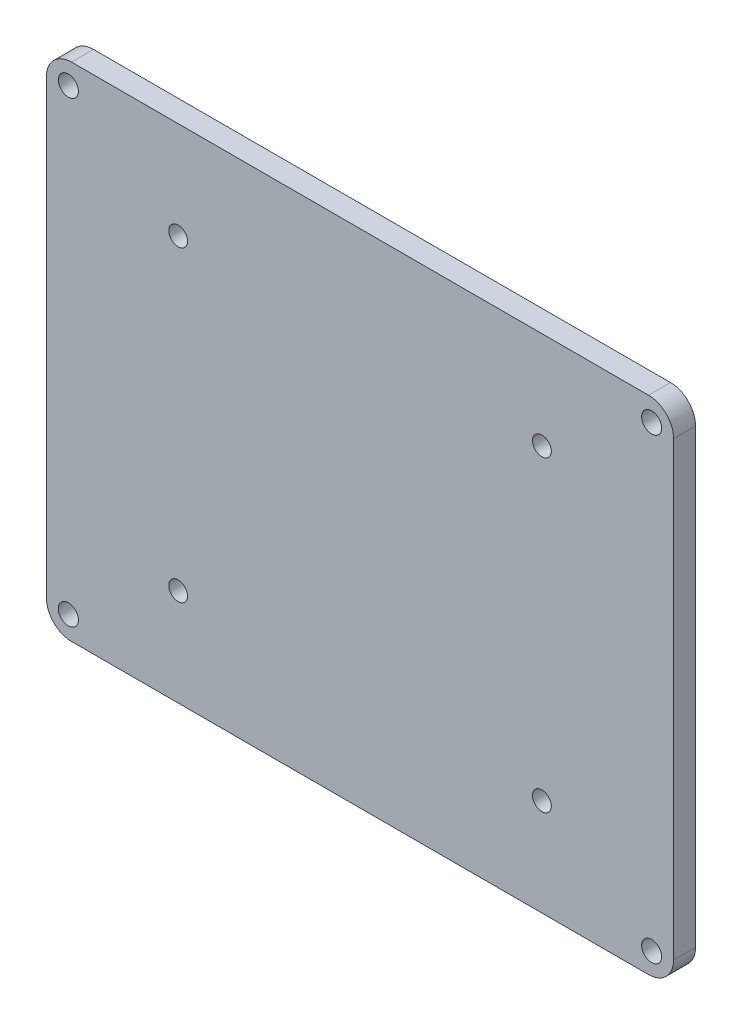
ISO-10303-21;
HEADER;
FILE_DESCRIPTION(('STEP AP214'),'2;1');
FILE_NAME('part.step','',(''),(''),'','','');
FILE_SCHEMA(('AUTOMOTIVE_DESIGN { 1 0 10303 214 1 1 1 1 }'));
ENDSEC;
DATA;
#1=APPLICATION_CONTEXT('core data for automotive mechanical design processes');
#2=APPLICATION_PROTOCOL_DEFINITION('international standard','automotive_design',2000,#1);
#3=PRODUCT_CONTEXT('',#1,'mechanical');
#4=PRODUCT('Part','Part','',(#3));
#5=PRODUCT_RELATED_PRODUCT_CATEGORY('part','',(#4));
#6=PRODUCT_DEFINITION_FORMATION('','',#4);
#7=PRODUCT_DEFINITION_CONTEXT('part definition',#1,'design');
#8=PRODUCT_DEFINITION('design','',#6,#7);
#9=PRODUCT_DEFINITION_SHAPE('','',#8);
#10=(LENGTH_UNIT() NAMED_UNIT(*) SI_UNIT(.MILLI.,.METRE.));
#11=(NAMED_UNIT(*) PLANE_ANGLE_UNIT() SI_UNIT($,.RADIAN.));
#12=(NAMED_UNIT(*) SI_UNIT($,.STERADIAN.) SOLID_ANGLE_UNIT());
#13=UNCERTAINTY_MEASURE_WITH_UNIT(LENGTH_MEASURE(1.E-05),#10,'distance_accuracy_value','');
#14=(GEOMETRIC_REPRESENTATION_CONTEXT(3) GLOBAL_UNCERTAINTY_ASSIGNED_CONTEXT((#13)) GLOBAL_UNIT_ASSIGNED_CONTEXT((#10,
#11,#12)) REPRESENTATION_CONTEXT('',''));
#15=CARTESIAN_POINT('',(0.,0.,0.));
#16=DIRECTION('',(0.,0.,1.));
#17=DIRECTION('',(1.,0.,0.));
#18=AXIS2_PLACEMENT_3D('',#15,#16,#17);
#19=CARTESIAN_POINT('',(46.,36.,3.5));
#20=DIRECTION('',(0.,0.,1.));
#21=DIRECTION('',(1.,0.,0.));
#22=AXIS2_PLACEMENT_3D('',#19,#20,#21);
#23=PLANE('',#22);
#24=CARTESIAN_POINT('',(29.,24.5,3.5));
#25=DIRECTION('',(0.,0.,1.));
#26=DIRECTION('',(1.,0.,0.));
#27=AXIS2_PLACEMENT_3D('',#24,#25,#26);
#28=CIRCLE('',#27,1.5);
#29=CARTESIAN_POINT('',(30.5,24.5,3.5));
#30=VERTEX_POINT('',#29);
#31=EDGE_CURVE('E332',#30,#30,#28,.T.);
#32=ORIENTED_EDGE('',*,*,#31,.F.);
#33=EDGE_LOOP('',(#32));
#34=FACE_BOUND('',#33,.T.);
#35=CARTESIAN_POINT('',(29.,-24.5,3.5));
#36=DIRECTION('',(0.,0.,1.));
#37=DIRECTION('',(1.,0.,0.));
#38=AXIS2_PLACEMENT_3D('',#35,#36,#37);
#39=CIRCLE('',#38,1.5);
#40=CARTESIAN_POINT('',(30.5,-24.5,3.5));
#41=VERTEX_POINT('',#40);
#42=EDGE_CURVE('E326',#41,#41,#39,.T.);
#43=ORIENTED_EDGE('',*,*,#42,.F.);
#44=EDGE_LOOP('',(#43));
#45=FACE_BOUND('',#44,.T.);
#46=CARTESIAN_POINT('',(-29.,-24.5,3.5));
#47=DIRECTION('',(0.,0.,1.));
#48=DIRECTION('',(1.,0.,0.));
#49=AXIS2_PLACEMENT_3D('',#46,#47,#48);
#50=CIRCLE('',#49,1.5);
#51=CARTESIAN_POINT('',(-27.5,-24.5,3.5));
#52=VERTEX_POINT('',#51);
#53=EDGE_CURVE('E318',#52,#52,#50,.T.);
#54=ORIENTED_EDGE('',*,*,#53,.F.);
#55=EDGE_LOOP('',(#54));
#56=FACE_BOUND('',#55,.T.);
#57=CARTESIAN_POINT('',(-29.,24.5,3.5));
#58=DIRECTION('',(0.,0.,1.));
#59=DIRECTION('',(1.,0.,0.));
#60=AXIS2_PLACEMENT_3D('',#57,#58,#59);
#61=CIRCLE('',#60,1.5);
#62=CARTESIAN_POINT('',(-27.5,24.5,3.5));
#63=VERTEX_POINT('',#62);
#64=EDGE_CURVE('E190',#63,#63,#61,.T.);
#65=ORIENTED_EDGE('',*,*,#64,.F.);
#66=EDGE_LOOP('',(#65));
#67=FACE_BOUND('',#66,.T.);
#68=CARTESIAN_POINT('',(-46.5,-36.5,3.5));
#69=DIRECTION('',(0.,0.,1.));
#70=DIRECTION('',(1.,0.,0.));
#71=AXIS2_PLACEMENT_3D('',#68,#69,#70);
#72=CIRCLE('',#71,1.6);
#73=CARTESIAN_POINT('',(-44.9,-36.5,3.5));
#74=VERTEX_POINT('',#73);
#75=EDGE_CURVE('E215',#74,#74,#72,.T.);
#76=ORIENTED_EDGE('',*,*,#75,.F.);
#77=EDGE_LOOP('',(#76));
#78=FACE_BOUND('',#77,.T.);
#79=CARTESIAN_POINT('',(-46.5,36.5,3.5));
#80=DIRECTION('',(0.,0.,1.));
#81=DIRECTION('',(1.,0.,0.));
#82=AXIS2_PLACEMENT_3D('',#79,#80,#81);
#83=CIRCLE('',#82,1.6);
#84=CARTESIAN_POINT('',(-44.9,36.5,3.5));
#85=VERTEX_POINT('',#84);
#86=EDGE_CURVE('E149',#85,#85,#83,.T.);
#87=ORIENTED_EDGE('',*,*,#86,.F.);
#88=EDGE_LOOP('',(#87));
#89=FACE_BOUND('',#88,.T.);
#90=CARTESIAN_POINT('',(46.,36.,3.5));
#91=DIRECTION('',(0.,0.,1.));
#92=DIRECTION('',(1.,0.,0.));
#93=AXIS2_PLACEMENT_3D('',#90,#91,#92);
#94=CIRCLE('',#93,4.);
#95=CARTESIAN_POINT('',(50.,36.,3.5));
#96=VERTEX_POINT('',#95);
#97=CARTESIAN_POINT('',(46.,40.,3.5));
#98=VERTEX_POINT('',#97);
#99=EDGE_CURVE('E167',#96,#98,#94,.T.);
#100=ORIENTED_EDGE('',*,*,#99,.T.);
#101=DIRECTION('',(-1.,0.,0.));
#102=VECTOR('',#101,1.);
#103=CARTESIAN_POINT('',(-46.,40.,3.5));
#104=LINE('',#103,#102);
#105=CARTESIAN_POINT('',(-46.,40.,3.5));
#106=VERTEX_POINT('',#105);
#107=EDGE_CURVE('E103',#98,#106,#104,.T.);
#108=ORIENTED_EDGE('',*,*,#107,.T.);
#109=CARTESIAN_POINT('',(-46.,36.,3.5));
#110=DIRECTION('',(0.,0.,1.));
#111=DIRECTION('',(-1.,0.,0.));
#112=AXIS2_PLACEMENT_3D('',#109,#110,#111);
#113=CIRCLE('',#112,4.);
#114=CARTESIAN_POINT('',(-50.,36.,3.5));
#115=VERTEX_POINT('',#114);
#116=EDGE_CURVE('E241',#106,#115,#113,.T.);
#117=ORIENTED_EDGE('',*,*,#116,.T.);
#118=DIRECTION('',(0.,-1.,0.));
#119=VECTOR('',#118,1.);
#120=CARTESIAN_POINT('',(-50.,-36.,3.5));
#121=LINE('',#120,#119);
#122=CARTESIAN_POINT('',(-50.,-36.,3.5));
#123=VERTEX_POINT('',#122);
#124=EDGE_CURVE('E244',#115,#123,#121,.T.);
#125=ORIENTED_EDGE('',*,*,#124,.T.);
#126=CARTESIAN_POINT('',(-46.,-36.,3.5));
#127=DIRECTION('',(0.,0.,1.));
#128=DIRECTION('',(-1.,0.,0.));
#129=AXIS2_PLACEMENT_3D('',#126,#127,#128);
#130=CIRCLE('',#129,4.);
#131=CARTESIAN_POINT('',(-46.,-40.,3.5));
#132=VERTEX_POINT('',#131);
#133=EDGE_CURVE('E122',#123,#132,#130,.T.);
#134=ORIENTED_EDGE('',*,*,#133,.T.);
#135=DIRECTION('',(1.,0.,0.));
#136=VECTOR('',#135,1.);
#137=CARTESIAN_POINT('',(-46.,-40.,3.5));
#138=LINE('',#137,#136);
#139=CARTESIAN_POINT('',(46.,-40.,3.5));
#140=VERTEX_POINT('',#139);
#141=EDGE_CURVE('E116',#132,#140,#138,.T.);
#142=ORIENTED_EDGE('',*,*,#141,.T.);
#143=CARTESIAN_POINT('',(46.,-36.,3.5));
#144=DIRECTION('',(0.,0.,1.));
#145=DIRECTION('',(1.,0.,0.));
#146=AXIS2_PLACEMENT_3D('',#143,#144,#145);
#147=CIRCLE('',#146,4.);
#148=CARTESIAN_POINT('',(50.,-36.,3.5));
#149=VERTEX_POINT('',#148);
#150=EDGE_CURVE('E120',#140,#149,#147,.T.);
#151=ORIENTED_EDGE('',*,*,#150,.T.);
#152=DIRECTION('',(0.,1.,0.));
#153=VECTOR('',#152,1.);
#154=CARTESIAN_POINT('',(50.,-36.,3.5));
#155=LINE('',#154,#153);
#156=EDGE_CURVE('E60',#149,#96,#155,.T.);
#157=ORIENTED_EDGE('',*,*,#156,.T.);
#158=EDGE_LOOP('',(#100,#108,#117,#125,#134,#142,#151,#157));
#159=FACE_BOUND('',#158,.T.);
#160=CARTESIAN_POINT('',(46.5,36.5,3.5));
#161=DIRECTION('',(0.,0.,1.));
#162=DIRECTION('',(1.,0.,0.));
#163=AXIS2_PLACEMENT_3D('',#160,#161,#162);
#164=CIRCLE('',#163,1.6);
#165=CARTESIAN_POINT('',(48.1,36.5,3.5));
#166=VERTEX_POINT('',#165);
#167=EDGE_CURVE('E223',#166,#166,#164,.T.);
#168=ORIENTED_EDGE('',*,*,#167,.F.);
#169=EDGE_LOOP('',(#168));
#170=FACE_BOUND('',#169,.T.);
#171=CARTESIAN_POINT('',(46.5,-36.5,3.5));
#172=DIRECTION('',(0.,0.,1.));
#173=DIRECTION('',(1.,0.,0.));
#174=AXIS2_PLACEMENT_3D('',#171,#172,#173);
#175=CIRCLE('',#174,1.6);
#176=CARTESIAN_POINT('',(48.1,-36.5,3.5));
#177=VERTEX_POINT('',#176);
#178=EDGE_CURVE('E205',#177,#177,#175,.T.);
#179=ORIENTED_EDGE('',*,*,#178,.F.);
#180=EDGE_LOOP('',(#179));
#181=FACE_BOUND('',#180,.T.);
#182=ADVANCED_FACE('F40',(#34,#45,#56,#67,#78,#89,#159,#170,#181),#23,.T.);
#183=CARTESIAN_POINT('',(46.,36.,0.));
#184=DIRECTION('',(0.,0.,1.));
#185=DIRECTION('',(1.,0.,0.));
#186=AXIS2_PLACEMENT_3D('',#183,#184,#185);
#187=PLANE('',#186);
#188=CARTESIAN_POINT('',(29.,24.5,0.));
#189=DIRECTION('',(0.,0.,1.));
#190=DIRECTION('',(1.,0.,0.));
#191=AXIS2_PLACEMENT_3D('',#188,#189,#190);
#192=CIRCLE('',#191,1.5);
#193=CARTESIAN_POINT('',(30.5,24.5,0.));
#194=VERTEX_POINT('',#193);
#195=EDGE_CURVE('E44',#194,#194,#192,.T.);
#196=ORIENTED_EDGE('',*,*,#195,.T.);
#197=EDGE_LOOP('',(#196));
#198=FACE_BOUND('',#197,.T.);
#199=CARTESIAN_POINT('',(29.,-24.5,0.));
#200=DIRECTION('',(0.,0.,1.));
#201=DIRECTION('',(1.,0.,0.));
#202=AXIS2_PLACEMENT_3D('',#199,#200,#201);
#203=CIRCLE('',#202,1.5);
#204=CARTESIAN_POINT('',(30.5,-24.5,0.));
#205=VERTEX_POINT('',#204);
#206=EDGE_CURVE('E193',#205,#205,#203,.T.);
#207=ORIENTED_EDGE('',*,*,#206,.T.);
#208=EDGE_LOOP('',(#207));
#209=FACE_BOUND('',#208,.T.);
#210=CARTESIAN_POINT('',(-29.,-24.5,0.));
#211=DIRECTION('',(0.,0.,1.));
#212=DIRECTION('',(1.,0.,0.));
#213=AXIS2_PLACEMENT_3D('',#210,#211,#212);
#214=CIRCLE('',#213,1.5);
#215=CARTESIAN_POINT('',(-27.5,-24.5,0.));
#216=VERTEX_POINT('',#215);
#217=EDGE_CURVE('E189',#216,#216,#214,.T.);
#218=ORIENTED_EDGE('',*,*,#217,.T.);
#219=EDGE_LOOP('',(#218));
#220=FACE_BOUND('',#219,.T.);
#221=CARTESIAN_POINT('',(-29.,24.5,0.));
#222=DIRECTION('',(0.,0.,1.));
#223=DIRECTION('',(1.,0.,0.));
#224=AXIS2_PLACEMENT_3D('',#221,#222,#223);
#225=CIRCLE('',#224,1.5);
#226=CARTESIAN_POINT('',(-27.5,24.5,0.));
#227=VERTEX_POINT('',#226);
#228=EDGE_CURVE('E185',#227,#227,#225,.T.);
#229=ORIENTED_EDGE('',*,*,#228,.T.);
#230=EDGE_LOOP('',(#229));
#231=FACE_BOUND('',#230,.T.);
#232=CARTESIAN_POINT('',(46.,36.,0.));
#233=DIRECTION('',(0.,0.,1.));
#234=DIRECTION('',(1.,0.,0.));
#235=AXIS2_PLACEMENT_3D('',#232,#233,#234);
#236=CIRCLE('',#235,4.);
#237=CARTESIAN_POINT('',(50.,36.,0.));
#238=VERTEX_POINT('',#237);
#239=CARTESIAN_POINT('',(46.,40.,0.));
#240=VERTEX_POINT('',#239);
#241=EDGE_CURVE('E144',#238,#240,#236,.T.);
#242=ORIENTED_EDGE('',*,*,#241,.F.);
#243=DIRECTION('',(0.,1.,0.));
#244=VECTOR('',#243,1.);
#245=CARTESIAN_POINT('',(50.,-36.,0.));
#246=LINE('',#245,#244);
#247=CARTESIAN_POINT('',(50.,-36.,0.));
#248=VERTEX_POINT('',#247);
#249=EDGE_CURVE('E95',#248,#238,#246,.T.);
#250=ORIENTED_EDGE('',*,*,#249,.F.);
#251=CARTESIAN_POINT('',(46.,-36.,0.));
#252=DIRECTION('',(0.,0.,1.));
#253=DIRECTION('',(1.,0.,0.));
#254=AXIS2_PLACEMENT_3D('',#251,#252,#253);
#255=CIRCLE('',#254,4.);
#256=CARTESIAN_POINT('',(46.,-40.,0.));
#257=VERTEX_POINT('',#256);
#258=EDGE_CURVE('E89',#257,#248,#255,.T.);
#259=ORIENTED_EDGE('',*,*,#258,.F.);
#260=DIRECTION('',(1.,0.,0.));
#261=VECTOR('',#260,1.);
#262=CARTESIAN_POINT('',(-46.,-40.,0.));
#263=LINE('',#262,#261);
#264=CARTESIAN_POINT('',(-46.,-40.,0.));
#265=VERTEX_POINT('',#264);
#266=EDGE_CURVE('E131',#265,#257,#263,.T.);
#267=ORIENTED_EDGE('',*,*,#266,.F.);
#268=CARTESIAN_POINT('',(-46.,-36.,0.));
#269=DIRECTION('',(0.,0.,1.));
#270=DIRECTION('',(-1.,0.,0.));
#271=AXIS2_PLACEMENT_3D('',#268,#269,#270);
#272=CIRCLE('',#271,4.);
#273=CARTESIAN_POINT('',(-50.,-36.,0.));
#274=VERTEX_POINT('',#273);
#275=EDGE_CURVE('E158',#274,#265,#272,.T.);
#276=ORIENTED_EDGE('',*,*,#275,.F.);
#277=DIRECTION('',(0.,-1.,0.));
#278=VECTOR('',#277,1.);
#279=CARTESIAN_POINT('',(-50.,-36.,0.));
#280=LINE('',#279,#278);
#281=CARTESIAN_POINT('',(-50.,36.,0.));
#282=VERTEX_POINT('',#281);
#283=EDGE_CURVE('E155',#282,#274,#280,.T.);
#284=ORIENTED_EDGE('',*,*,#283,.F.);
#285=CARTESIAN_POINT('',(-46.,36.,0.));
#286=DIRECTION('',(0.,0.,1.));
#287=DIRECTION('',(-1.,0.,0.));
#288=AXIS2_PLACEMENT_3D('',#285,#286,#287);
#289=CIRCLE('',#288,4.);
#290=CARTESIAN_POINT('',(-46.,40.,0.));
#291=VERTEX_POINT('',#290);
#292=EDGE_CURVE('E152',#291,#282,#289,.T.);
#293=ORIENTED_EDGE('',*,*,#292,.F.);
#294=DIRECTION('',(-1.,0.,0.));
#295=VECTOR('',#294,1.);
#296=CARTESIAN_POINT('',(-46.,40.,0.));
#297=LINE('',#296,#295);
#298=EDGE_CURVE('E148',#240,#291,#297,.T.);
#299=ORIENTED_EDGE('',*,*,#298,.F.);
#300=EDGE_LOOP('',(#242,#250,#259,#267,#276,#284,#293,#299));
#301=FACE_BOUND('',#300,.T.);
#302=CARTESIAN_POINT('',(-46.5,36.5,0.));
#303=DIRECTION('',(0.,0.,1.));
#304=DIRECTION('',(1.,0.,0.));
#305=AXIS2_PLACEMENT_3D('',#302,#303,#304);
#306=CIRCLE('',#305,1.6);
#307=CARTESIAN_POINT('',(-44.9,36.5,0.));
#308=VERTEX_POINT('',#307);
#309=EDGE_CURVE('E227',#308,#308,#306,.T.);
#310=ORIENTED_EDGE('',*,*,#309,.T.);
#311=EDGE_LOOP('',(#310));
#312=FACE_BOUND('',#311,.T.);
#313=CARTESIAN_POINT('',(46.5,36.5,0.));
#314=DIRECTION('',(0.,0.,1.));
#315=DIRECTION('',(1.,0.,0.));
#316=AXIS2_PLACEMENT_3D('',#313,#314,#315);
#317=CIRCLE('',#316,1.6);
#318=CARTESIAN_POINT('',(48.1,36.5,0.));
#319=VERTEX_POINT('',#318);
#320=EDGE_CURVE('E219',#319,#319,#317,.T.);
#321=ORIENTED_EDGE('',*,*,#320,.T.);
#322=EDGE_LOOP('',(#321));
#323=FACE_BOUND('',#322,.T.);
#324=CARTESIAN_POINT('',(-46.5,-36.5,0.));
#325=DIRECTION('',(0.,0.,1.));
#326=DIRECTION('',(1.,0.,0.));
#327=AXIS2_PLACEMENT_3D('',#324,#325,#326);
#328=CIRCLE('',#327,1.6);
#329=CARTESIAN_POINT('',(-44.9,-36.5,0.));
#330=VERTEX_POINT('',#329);
#331=EDGE_CURVE('E211',#330,#330,#328,.T.);
#332=ORIENTED_EDGE('',*,*,#331,.T.);
#333=EDGE_LOOP('',(#332));
#334=FACE_BOUND('',#333,.T.);
#335=CARTESIAN_POINT('',(46.5,-36.5,0.));
#336=DIRECTION('',(0.,0.,1.));
#337=DIRECTION('',(1.,0.,0.));
#338=AXIS2_PLACEMENT_3D('',#335,#336,#337);
#339=CIRCLE('',#338,1.6);
#340=CARTESIAN_POINT('',(48.1,-36.5,0.));
#341=VERTEX_POINT('',#340);
#342=EDGE_CURVE('E200',#341,#341,#339,.T.);
#343=ORIENTED_EDGE('',*,*,#342,.T.);
#344=EDGE_LOOP('',(#343));
#345=FACE_BOUND('',#344,.T.);
#346=ADVANCED_FACE('F259',(#198,#209,#220,#231,#301,#312,#323,#334,#345),#187,.F.);
#347=CARTESIAN_POINT('',(46.,36.,3.5));
#348=DIRECTION('',(0.,0.,-1.));
#349=DIRECTION('',(-1.,0.,0.));
#350=AXIS2_PLACEMENT_3D('',#347,#348,#349);
#351=CYLINDRICAL_SURFACE('',#350,4.);
#352=ORIENTED_EDGE('',*,*,#241,.T.);
#353=DIRECTION('',(0.,0.,-1.));
#354=VECTOR('',#353,1.);
#355=CARTESIAN_POINT('',(46.,40.,3.5));
#356=LINE('',#355,#354);
#357=EDGE_CURVE('E11',#98,#240,#356,.T.);
#358=ORIENTED_EDGE('',*,*,#357,.F.);
#359=ORIENTED_EDGE('',*,*,#99,.F.);
#360=DIRECTION('',(0.,0.,-1.));
#361=VECTOR('',#360,1.);
#362=CARTESIAN_POINT('',(50.,36.,3.5));
#363=LINE('',#362,#361);
#364=EDGE_CURVE('E140',#96,#238,#363,.T.);
#365=ORIENTED_EDGE('',*,*,#364,.T.);
#366=EDGE_LOOP('',(#352,#358,#359,#365));
#367=FACE_BOUND('',#366,.T.);
#368=ADVANCED_FACE('F42',(#367),#351,.T.);
#369=CARTESIAN_POINT('',(-46.,40.,3.5));
#370=DIRECTION('',(0.,-1.,0.));
#371=DIRECTION('',(0.,0.,-1.));
#372=AXIS2_PLACEMENT_3D('',#369,#370,#371);
#373=PLANE('',#372);
#374=ORIENTED_EDGE('',*,*,#298,.T.);
#375=DIRECTION('',(0.,0.,-1.));
#376=VECTOR('',#375,1.);
#377=CARTESIAN_POINT('',(-46.,40.,3.5));
#378=LINE('',#377,#376);
#379=EDGE_CURVE('E51',#106,#291,#378,.T.);
#380=ORIENTED_EDGE('',*,*,#379,.F.);
#381=ORIENTED_EDGE('',*,*,#107,.F.);
#382=ORIENTED_EDGE('',*,*,#357,.T.);
#383=EDGE_LOOP('',(#374,#380,#381,#382));
#384=FACE_BOUND('',#383,.T.);
#385=ADVANCED_FACE('F438',(#384),#373,.F.);
#386=CARTESIAN_POINT('',(-46.,36.,3.5));
#387=DIRECTION('',(0.,0.,-1.));
#388=DIRECTION('',(-1.,0.,0.));
#389=AXIS2_PLACEMENT_3D('',#386,#387,#388);
#390=CYLINDRICAL_SURFACE('',#389,4.);
#391=ORIENTED_EDGE('',*,*,#292,.T.);
#392=DIRECTION('',(0.,0.,-1.));
#393=VECTOR('',#392,1.);
#394=CARTESIAN_POINT('',(-50.,36.,3.5));
#395=LINE('',#394,#393);
#396=EDGE_CURVE('E178',#115,#282,#395,.T.);
#397=ORIENTED_EDGE('',*,*,#396,.F.);
#398=ORIENTED_EDGE('',*,*,#116,.F.);
#399=ORIENTED_EDGE('',*,*,#379,.T.);
#400=EDGE_LOOP('',(#391,#397,#398,#399));
#401=FACE_BOUND('',#400,.T.);
#402=ADVANCED_FACE('F430',(#401),#390,.T.);
#403=CARTESIAN_POINT('',(-50.,-36.,3.5));
#404=DIRECTION('',(1.,0.,0.));
#405=DIRECTION('',(0.,0.,-1.));
#406=AXIS2_PLACEMENT_3D('',#403,#404,#405);
#407=PLANE('',#406);
#408=ORIENTED_EDGE('',*,*,#283,.T.);
#409=DIRECTION('',(0.,0.,-1.));
#410=VECTOR('',#409,1.);
#411=CARTESIAN_POINT('',(-50.,-36.,3.5));
#412=LINE('',#411,#410);
#413=EDGE_CURVE('E174',#123,#274,#412,.T.);
#414=ORIENTED_EDGE('',*,*,#413,.F.);
#415=ORIENTED_EDGE('',*,*,#124,.F.);
#416=ORIENTED_EDGE('',*,*,#396,.T.);
#417=EDGE_LOOP('',(#408,#414,#415,#416));
#418=FACE_BOUND('',#417,.T.);
#419=ADVANCED_FACE('F252',(#418),#407,.F.);
#420=CARTESIAN_POINT('',(-46.,-36.,3.5));
#421=DIRECTION('',(0.,0.,-1.));
#422=DIRECTION('',(-1.,0.,0.));
#423=AXIS2_PLACEMENT_3D('',#420,#421,#422);
#424=CYLINDRICAL_SURFACE('',#423,4.);
#425=ORIENTED_EDGE('',*,*,#275,.T.);
#426=DIRECTION('',(0.,0.,-1.));
#427=VECTOR('',#426,1.);
#428=CARTESIAN_POINT('',(-46.,-40.,3.5));
#429=LINE('',#428,#427);
#430=EDGE_CURVE('E133',#132,#265,#429,.T.);
#431=ORIENTED_EDGE('',*,*,#430,.F.);
#432=ORIENTED_EDGE('',*,*,#133,.F.);
#433=ORIENTED_EDGE('',*,*,#413,.T.);
#434=EDGE_LOOP('',(#425,#431,#432,#433));
#435=FACE_BOUND('',#434,.T.);
#436=ADVANCED_FACE('F256',(#435),#424,.T.);
#437=CARTESIAN_POINT('',(-46.,-40.,3.5));
#438=DIRECTION('',(0.,1.,0.));
#439=DIRECTION('',(0.,0.,1.));
#440=AXIS2_PLACEMENT_3D('',#437,#438,#439);
#441=PLANE('',#440);
#442=ORIENTED_EDGE('',*,*,#266,.T.);
#443=DIRECTION('',(0.,0.,-1.));
#444=VECTOR('',#443,1.);
#445=CARTESIAN_POINT('',(46.,-40.,3.5));
#446=LINE('',#445,#444);
#447=EDGE_CURVE('E128',#140,#257,#446,.T.);
#448=ORIENTED_EDGE('',*,*,#447,.F.);
#449=ORIENTED_EDGE('',*,*,#141,.F.);
#450=ORIENTED_EDGE('',*,*,#430,.T.);
#451=EDGE_LOOP('',(#442,#448,#449,#450));
#452=FACE_BOUND('',#451,.T.);
#453=ADVANCED_FACE('F129',(#452),#441,.F.);
#454=CARTESIAN_POINT('',(46.,-36.,3.5));
#455=DIRECTION('',(0.,0.,-1.));
#456=DIRECTION('',(-1.,0.,0.));
#457=AXIS2_PLACEMENT_3D('',#454,#455,#456);
#458=CYLINDRICAL_SURFACE('',#457,4.);
#459=ORIENTED_EDGE('',*,*,#258,.T.);
#460=DIRECTION('',(0.,0.,-1.));
#461=VECTOR('',#460,1.);
#462=CARTESIAN_POINT('',(50.,-36.,3.5));
#463=LINE('',#462,#461);
#464=EDGE_CURVE('E134',#149,#248,#463,.T.);
#465=ORIENTED_EDGE('',*,*,#464,.F.);
#466=ORIENTED_EDGE('',*,*,#150,.F.);
#467=ORIENTED_EDGE('',*,*,#447,.T.);
#468=EDGE_LOOP('',(#459,#465,#466,#467));
#469=FACE_BOUND('',#468,.T.);
#470=ADVANCED_FACE('F136',(#469),#458,.T.);
#471=CARTESIAN_POINT('',(50.,-36.,3.5));
#472=DIRECTION('',(-1.,0.,0.));
#473=DIRECTION('',(0.,0.,1.));
#474=AXIS2_PLACEMENT_3D('',#471,#472,#473);
#475=PLANE('',#474);
#476=ORIENTED_EDGE('',*,*,#249,.T.);
#477=ORIENTED_EDGE('',*,*,#364,.F.);
#478=ORIENTED_EDGE('',*,*,#156,.F.);
#479=ORIENTED_EDGE('',*,*,#464,.T.);
#480=EDGE_LOOP('',(#476,#477,#478,#479));
#481=FACE_BOUND('',#480,.T.);
#482=ADVANCED_FACE('F265',(#481),#475,.F.);
#483=CARTESIAN_POINT('',(-46.5,36.5,3.5));
#484=DIRECTION('',(0.,0.,-1.));
#485=DIRECTION('',(-1.,0.,0.));
#486=AXIS2_PLACEMENT_3D('',#483,#484,#485);
#487=CYLINDRICAL_SURFACE('',#486,1.6);
#488=ORIENTED_EDGE('',*,*,#86,.T.);
#489=EDGE_LOOP('',(#488));
#490=FACE_BOUND('',#489,.T.);
#491=ORIENTED_EDGE('',*,*,#309,.F.);
#492=EDGE_LOOP('',(#491));
#493=FACE_BOUND('',#492,.T.);
#494=ADVANCED_FACE('F267',(#490,#493),#487,.F.);
#495=CARTESIAN_POINT('',(46.5,36.5,3.5));
#496=DIRECTION('',(0.,0.,-1.));
#497=DIRECTION('',(-1.,0.,0.));
#498=AXIS2_PLACEMENT_3D('',#495,#496,#497);
#499=CYLINDRICAL_SURFACE('',#498,1.6);
#500=ORIENTED_EDGE('',*,*,#167,.T.);
#501=EDGE_LOOP('',(#500));
#502=FACE_BOUND('',#501,.T.);
#503=ORIENTED_EDGE('',*,*,#320,.F.);
#504=EDGE_LOOP('',(#503));
#505=FACE_BOUND('',#504,.T.);
#506=ADVANCED_FACE('F273',(#502,#505),#499,.F.);
#507=CARTESIAN_POINT('',(-46.5,-36.5,3.5));
#508=DIRECTION('',(0.,0.,-1.));
#509=DIRECTION('',(-1.,0.,0.));
#510=AXIS2_PLACEMENT_3D('',#507,#508,#509);
#511=CYLINDRICAL_SURFACE('',#510,1.6);
#512=ORIENTED_EDGE('',*,*,#75,.T.);
#513=EDGE_LOOP('',(#512));
#514=FACE_BOUND('',#513,.T.);
#515=ORIENTED_EDGE('',*,*,#331,.F.);
#516=EDGE_LOOP('',(#515));
#517=FACE_BOUND('',#516,.T.);
#518=ADVANCED_FACE('F289',(#514,#517),#511,.F.);
#519=CARTESIAN_POINT('',(46.5,-36.5,3.5));
#520=DIRECTION('',(0.,0.,-1.));
#521=DIRECTION('',(-1.,0.,0.));
#522=AXIS2_PLACEMENT_3D('',#519,#520,#521);
#523=CYLINDRICAL_SURFACE('',#522,1.6);
#524=ORIENTED_EDGE('',*,*,#178,.T.);
#525=EDGE_LOOP('',(#524));
#526=FACE_BOUND('',#525,.T.);
#527=ORIENTED_EDGE('',*,*,#342,.F.);
#528=EDGE_LOOP('',(#527));
#529=FACE_BOUND('',#528,.T.);
#530=ADVANCED_FACE('F293',(#526,#529),#523,.F.);
#531=CARTESIAN_POINT('',(-29.,24.5,-4.5));
#532=DIRECTION('',(0.,0.,1.));
#533=DIRECTION('',(1.,0.,0.));
#534=AXIS2_PLACEMENT_3D('',#531,#532,#533);
#535=CYLINDRICAL_SURFACE('',#534,1.5);
#536=ORIENTED_EDGE('',*,*,#64,.T.);
#537=EDGE_LOOP('',(#536));
#538=FACE_BOUND('',#537,.T.);
#539=ORIENTED_EDGE('',*,*,#228,.F.);
#540=EDGE_LOOP('',(#539));
#541=FACE_BOUND('',#540,.T.);
#542=ADVANCED_FACE('F297',(#538,#541),#535,.F.);
#543=CARTESIAN_POINT('',(-29.,-24.5,-4.5));
#544=DIRECTION('',(0.,0.,1.));
#545=DIRECTION('',(1.,0.,0.));
#546=AXIS2_PLACEMENT_3D('',#543,#544,#545);
#547=CYLINDRICAL_SURFACE('',#546,1.5);
#548=ORIENTED_EDGE('',*,*,#53,.T.);
#549=EDGE_LOOP('',(#548));
#550=FACE_BOUND('',#549,.T.);
#551=ORIENTED_EDGE('',*,*,#217,.F.);
#552=EDGE_LOOP('',(#551));
#553=FACE_BOUND('',#552,.T.);
#554=ADVANCED_FACE('F301',(#550,#553),#547,.F.);
#555=CARTESIAN_POINT('',(29.,-24.5,-4.5));
#556=DIRECTION('',(0.,0.,1.));
#557=DIRECTION('',(1.,0.,0.));
#558=AXIS2_PLACEMENT_3D('',#555,#556,#557);
#559=CYLINDRICAL_SURFACE('',#558,1.5);
#560=ORIENTED_EDGE('',*,*,#42,.T.);
#561=EDGE_LOOP('',(#560));
#562=FACE_BOUND('',#561,.T.);
#563=ORIENTED_EDGE('',*,*,#206,.F.);
#564=EDGE_LOOP('',(#563));
#565=FACE_BOUND('',#564,.T.);
#566=ADVANCED_FACE('F306',(#562,#565),#559,.F.);
#567=CARTESIAN_POINT('',(29.,24.5,-4.5));
#568=DIRECTION('',(0.,0.,1.));
#569=DIRECTION('',(1.,0.,0.));
#570=AXIS2_PLACEMENT_3D('',#567,#568,#569);
#571=CYLINDRICAL_SURFACE('',#570,1.5);
#572=ORIENTED_EDGE('',*,*,#31,.T.);
#573=EDGE_LOOP('',(#572));
#574=FACE_BOUND('',#573,.T.);
#575=ORIENTED_EDGE('',*,*,#195,.F.);
#576=EDGE_LOOP('',(#575));
#577=FACE_BOUND('',#576,.T.);
#578=ADVANCED_FACE('F303',(#574,#577),#571,.F.);
#579=CLOSED_SHELL('',(#182,#346,#368,#385,#402,#419,#436,#453,#470,#482,#494,#506,#518,#530,
#542,#554,#566,#578));
#580=MANIFOLD_SOLID_BREP('B2',#579);
#581=ADVANCED_BREP_SHAPE_REPRESENTATION('',(#18,#580),#14);
#582=SHAPE_DEFINITION_REPRESENTATION(#9,#581);
ENDSEC;
END-ISO-10303-21;
